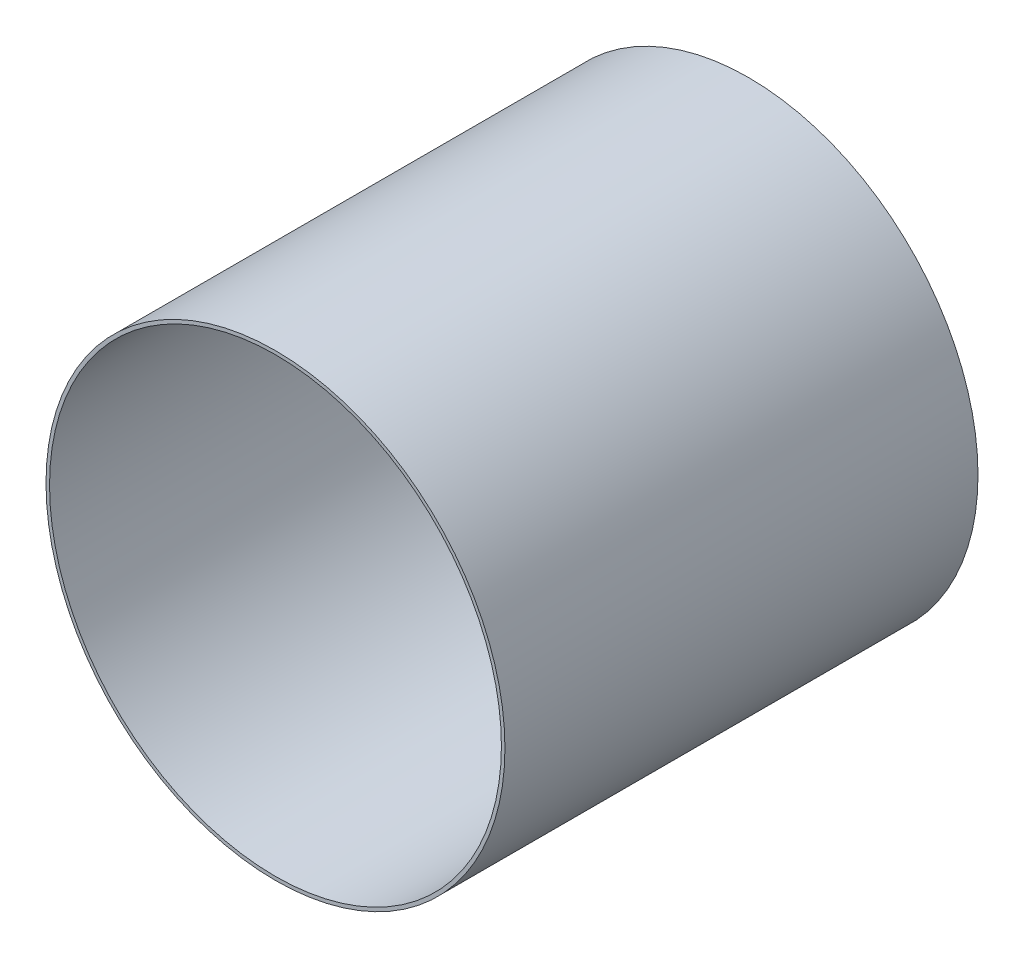
ISO-10303-21;
HEADER;
FILE_DESCRIPTION(('STEP AP214'),'2;1');
FILE_NAME('part.step','',(''),(''),'','','');
FILE_SCHEMA(('AUTOMOTIVE_DESIGN { 1 0 10303 214 1 1 1 1 }'));
ENDSEC;
DATA;
#1=APPLICATION_CONTEXT('core data for automotive mechanical design processes');
#2=APPLICATION_PROTOCOL_DEFINITION('international standard','automotive_design',2000,#1);
#3=PRODUCT_CONTEXT('',#1,'mechanical');
#4=PRODUCT('Part','Part','',(#3));
#5=PRODUCT_RELATED_PRODUCT_CATEGORY('part','',(#4));
#6=PRODUCT_DEFINITION_FORMATION('','',#4);
#7=PRODUCT_DEFINITION_CONTEXT('part definition',#1,'design');
#8=PRODUCT_DEFINITION('design','',#6,#7);
#9=PRODUCT_DEFINITION_SHAPE('','',#8);
#10=(LENGTH_UNIT() NAMED_UNIT(*) SI_UNIT(.MILLI.,.METRE.));
#11=(NAMED_UNIT(*) PLANE_ANGLE_UNIT() SI_UNIT($,.RADIAN.));
#12=(NAMED_UNIT(*) SI_UNIT($,.STERADIAN.) SOLID_ANGLE_UNIT());
#13=UNCERTAINTY_MEASURE_WITH_UNIT(LENGTH_MEASURE(1.E-05),#10,'distance_accuracy_value','');
#14=(GEOMETRIC_REPRESENTATION_CONTEXT(3) GLOBAL_UNCERTAINTY_ASSIGNED_CONTEXT((#13)) GLOBAL_UNIT_ASSIGNED_CONTEXT((#10,
#11,#12)) REPRESENTATION_CONTEXT('',''));
#15=CARTESIAN_POINT('',(0.,0.,0.));
#16=DIRECTION('',(0.,0.,1.));
#17=DIRECTION('',(1.,0.,0.));
#18=AXIS2_PLACEMENT_3D('',#15,#16,#17);
#19=CARTESIAN_POINT('',(0.,0.,0.));
#20=DIRECTION('',(0.,0.,1.));
#21=DIRECTION('',(1.,0.,0.));
#22=AXIS2_PLACEMENT_3D('',#19,#20,#21);
#23=CYLINDRICAL_SURFACE('',#22,320.);
#24=CARTESIAN_POINT('',(0.,0.,0.));
#25=DIRECTION('',(0.,0.,-1.));
#26=DIRECTION('',(1.,0.,0.));
#27=AXIS2_PLACEMENT_3D('',#24,#25,#26);
#28=CIRCLE('',#27,320.);
#29=CARTESIAN_POINT('',(-320.,0.,0.));
#30=VERTEX_POINT('',#29);
#31=EDGE_CURVE('E66',#30,#30,#28,.T.);
#32=ORIENTED_EDGE('',*,*,#31,.T.);
#33=DIRECTION('',(0.,0.,1.));
#34=VECTOR('',#33,1.);
#35=CARTESIAN_POINT('',(-320.,0.,0.));
#36=LINE('',#35,#34);
#37=CARTESIAN_POINT('',(-320.,0.,670.));
#38=VERTEX_POINT('',#37);
#39=EDGE_CURVE('E11',#30,#38,#36,.T.);
#40=ORIENTED_EDGE('',*,*,#39,.T.);
#41=CARTESIAN_POINT('',(0.,0.,670.));
#42=DIRECTION('',(0.,0.,-1.));
#43=DIRECTION('',(1.,0.,0.));
#44=AXIS2_PLACEMENT_3D('',#41,#42,#43);
#45=CIRCLE('',#44,320.);
#46=EDGE_CURVE('E21',#38,#38,#45,.T.);
#47=ORIENTED_EDGE('',*,*,#46,.F.);
#48=ORIENTED_EDGE('',*,*,#39,.F.);
#49=EDGE_LOOP('',(#32,#40,#47,#48));
#50=FACE_BOUND('',#49,.T.);
#51=ADVANCED_FACE('F17',(#50),#23,.F.);
#52=CARTESIAN_POINT('',(0.,0.,670.));
#53=DIRECTION('',(0.,0.,1.));
#54=DIRECTION('',(1.,0.,0.));
#55=AXIS2_PLACEMENT_3D('',#52,#53,#54);
#56=PLANE('',#55);
#57=ORIENTED_EDGE('',*,*,#46,.T.);
#58=EDGE_LOOP('',(#57));
#59=FACE_BOUND('',#58,.T.);
#60=CARTESIAN_POINT('',(0.,0.,670.));
#61=DIRECTION('',(0.,0.,1.));
#62=DIRECTION('',(1.,0.,0.));
#63=AXIS2_PLACEMENT_3D('',#60,#61,#62);
#64=CIRCLE('',#63,325.);
#65=CARTESIAN_POINT('',(-325.,0.,670.));
#66=VERTEX_POINT('',#65);
#67=EDGE_CURVE('E58',#66,#66,#64,.T.);
#68=ORIENTED_EDGE('',*,*,#67,.T.);
#69=EDGE_LOOP('',(#68));
#70=FACE_BOUND('',#69,.T.);
#71=ADVANCED_FACE('F81',(#59,#70),#56,.T.);
#72=CARTESIAN_POINT('',(0.,0.,0.));
#73=DIRECTION('',(0.,0.,1.));
#74=DIRECTION('',(1.,0.,0.));
#75=AXIS2_PLACEMENT_3D('',#72,#73,#74);
#76=CYLINDRICAL_SURFACE('',#75,325.);
#77=ORIENTED_EDGE('',*,*,#67,.F.);
#78=DIRECTION('',(0.,0.,-1.));
#79=VECTOR('',#78,1.);
#80=CARTESIAN_POINT('',(-325.,0.,0.));
#81=LINE('',#80,#79);
#82=CARTESIAN_POINT('',(-325.,0.,0.));
#83=VERTEX_POINT('',#82);
#84=EDGE_CURVE('E49',#66,#83,#81,.T.);
#85=ORIENTED_EDGE('',*,*,#84,.T.);
#86=CARTESIAN_POINT('',(0.,0.,0.));
#87=DIRECTION('',(0.,0.,1.));
#88=DIRECTION('',(1.,0.,0.));
#89=AXIS2_PLACEMENT_3D('',#86,#87,#88);
#90=CIRCLE('',#89,325.);
#91=EDGE_CURVE('E57',#83,#83,#90,.T.);
#92=ORIENTED_EDGE('',*,*,#91,.T.);
#93=ORIENTED_EDGE('',*,*,#84,.F.);
#94=EDGE_LOOP('',(#77,#85,#92,#93));
#95=FACE_BOUND('',#94,.T.);
#96=ADVANCED_FACE('F55',(#95),#76,.T.);
#97=CARTESIAN_POINT('',(0.,0.,0.));
#98=DIRECTION('',(0.,0.,1.));
#99=DIRECTION('',(1.,0.,0.));
#100=AXIS2_PLACEMENT_3D('',#97,#98,#99);
#101=PLANE('',#100);
#102=ORIENTED_EDGE('',*,*,#31,.F.);
#103=EDGE_LOOP('',(#102));
#104=FACE_BOUND('',#103,.T.);
#105=ORIENTED_EDGE('',*,*,#91,.F.);
#106=EDGE_LOOP('',(#105));
#107=FACE_BOUND('',#106,.T.);
#108=ADVANCED_FACE('F19',(#104,#107),#101,.F.);
#109=CLOSED_SHELL('',(#51,#71,#96,#108));
#110=MANIFOLD_SOLID_BREP('B1',#109);
#111=ADVANCED_BREP_SHAPE_REPRESENTATION('',(#18,#110),#14);
#112=SHAPE_DEFINITION_REPRESENTATION(#9,#111);
ENDSEC;
END-ISO-10303-21;
